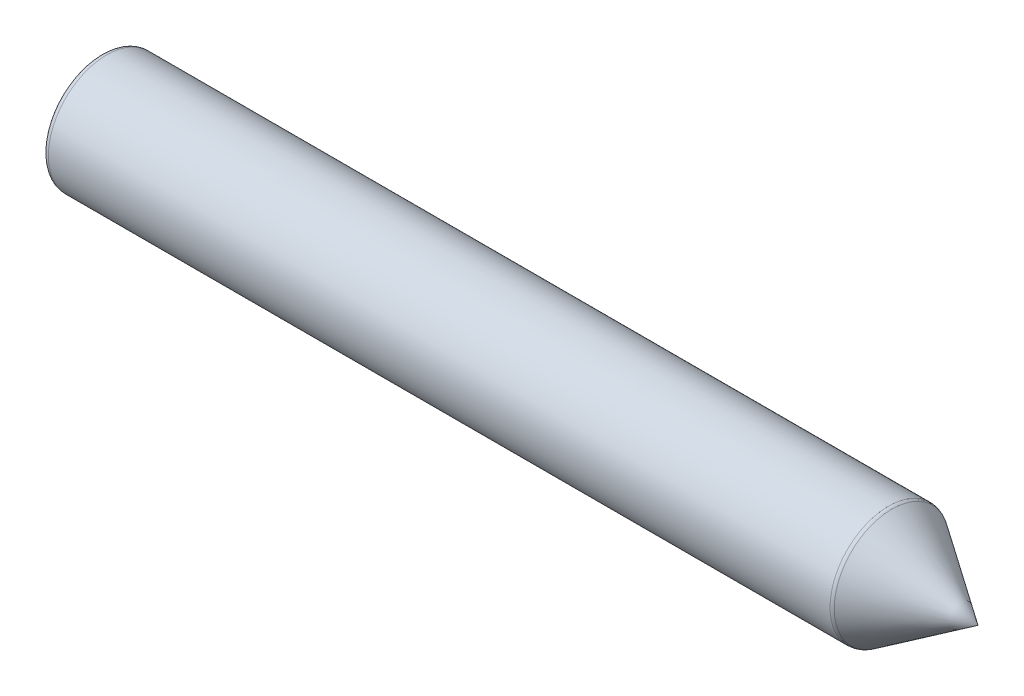
ISO-10303-21;
HEADER;
FILE_DESCRIPTION(('STEP AP214'),'2;1');
FILE_NAME('part.step','',(''),(''),'','','');
FILE_SCHEMA(('AUTOMOTIVE_DESIGN { 1 0 10303 214 1 1 1 1 }'));
ENDSEC;
DATA;
#1=APPLICATION_CONTEXT('core data for automotive mechanical design processes');
#2=APPLICATION_PROTOCOL_DEFINITION('international standard','automotive_design',2000,#1);
#3=PRODUCT_CONTEXT('',#1,'mechanical');
#4=PRODUCT('Part','Part','',(#3));
#5=PRODUCT_RELATED_PRODUCT_CATEGORY('part','',(#4));
#6=PRODUCT_DEFINITION_FORMATION('','',#4);
#7=PRODUCT_DEFINITION_CONTEXT('part definition',#1,'design');
#8=PRODUCT_DEFINITION('design','',#6,#7);
#9=PRODUCT_DEFINITION_SHAPE('','',#8);
#10=(LENGTH_UNIT() NAMED_UNIT(*) SI_UNIT(.MILLI.,.METRE.));
#11=(NAMED_UNIT(*) PLANE_ANGLE_UNIT() SI_UNIT($,.RADIAN.));
#12=(NAMED_UNIT(*) SI_UNIT($,.STERADIAN.) SOLID_ANGLE_UNIT());
#13=UNCERTAINTY_MEASURE_WITH_UNIT(LENGTH_MEASURE(1.E-05),#10,'distance_accuracy_value','');
#14=(GEOMETRIC_REPRESENTATION_CONTEXT(3) GLOBAL_UNCERTAINTY_ASSIGNED_CONTEXT((#13)) GLOBAL_UNIT_ASSIGNED_CONTEXT((#10,
#11,#12)) REPRESENTATION_CONTEXT('',''));
#15=CARTESIAN_POINT('',(0.,0.,0.));
#16=DIRECTION('',(0.,0.,1.));
#17=DIRECTION('',(1.,0.,0.));
#18=AXIS2_PLACEMENT_3D('',#15,#16,#17);
#19=CARTESIAN_POINT('',(150.,0.,0.));
#20=DIRECTION('',(-1.,0.,0.));
#21=DIRECTION('',(0.,0.,1.));
#22=AXIS2_PLACEMENT_3D('',#19,#20,#21);
#23=CONICAL_SURFACE('',#22,0.,0.588002603547568);
#24=CARTESIAN_POINT('',(135.251924558493,0.,0.));
#25=DIRECTION('',(1.,0.,0.));
#26=DIRECTION('',(0.,0.,-1.));
#27=AXIS2_PLACEMENT_3D('',#24,#25,#26);
#28=CIRCLE('',#27,9.83205029433784);
#29=CARTESIAN_POINT('',(135.251924558493,0.,-9.83205029433784));
#30=VERTEX_POINT('',#29);
#31=EDGE_CURVE('E42',#30,#30,#28,.T.);
#32=ORIENTED_EDGE('',*,*,#31,.T.);
#33=EDGE_LOOP('',(#32));
#34=FACE_BOUND('',#33,.T.);
#35=CARTESIAN_POINT('',(150.,0.,0.));
#36=VERTEX_POINT('',#35);
#37=VERTEX_LOOP('',#36);
#38=FACE_BOUND('',#37,.T.);
#39=ADVANCED_FACE('F35',(#34,#38),#23,.T.);
#40=CARTESIAN_POINT('',(0.,0.,0.));
#41=DIRECTION('',(-1.,0.,0.));
#42=DIRECTION('',(0.,0.,1.));
#43=AXIS2_PLACEMENT_3D('',#40,#41,#42);
#44=CYLINDRICAL_SURFACE('',#43,10.);
#45=CARTESIAN_POINT('',(134.697224362268,0.,0.));
#46=DIRECTION('',(1.,0.,0.));
#47=DIRECTION('',(0.,0.,-1.));
#48=AXIS2_PLACEMENT_3D('',#45,#46,#47);
#49=CIRCLE('',#48,10.);
#50=CARTESIAN_POINT('',(134.697224362268,0.,-10.));
#51=VERTEX_POINT('',#50);
#52=EDGE_CURVE('E70',#51,#51,#49,.F.);
#53=ORIENTED_EDGE('',*,*,#52,.T.);
#54=EDGE_LOOP('',(#53));
#55=FACE_BOUND('',#54,.T.);
#56=CARTESIAN_POINT('',(1.,0.,0.));
#57=DIRECTION('',(1.,0.,0.));
#58=DIRECTION('',(0.,0.,-1.));
#59=AXIS2_PLACEMENT_3D('',#56,#57,#58);
#60=CIRCLE('',#59,10.);
#61=CARTESIAN_POINT('',(1.,0.,-10.));
#62=VERTEX_POINT('',#61);
#63=EDGE_CURVE('E71',#62,#62,#60,.T.);
#64=ORIENTED_EDGE('',*,*,#63,.T.);
#65=EDGE_LOOP('',(#64));
#66=FACE_BOUND('',#65,.T.);
#67=ADVANCED_FACE('F46',(#55,#66),#44,.T.);
#68=CARTESIAN_POINT('',(0.,0.,0.));
#69=DIRECTION('',(1.,0.,0.));
#70=DIRECTION('',(0.,0.,-1.));
#71=AXIS2_PLACEMENT_3D('',#68,#69,#70);
#72=PLANE('',#71);
#73=CARTESIAN_POINT('',(0.,0.,0.));
#74=DIRECTION('',(1.,0.,0.));
#75=DIRECTION('',(0.,0.,-1.));
#76=AXIS2_PLACEMENT_3D('',#73,#74,#75);
#77=CIRCLE('',#76,9.);
#78=CARTESIAN_POINT('',(0.,0.,-9.));
#79=VERTEX_POINT('',#78);
#80=EDGE_CURVE('E11',#79,#79,#77,.F.);
#81=ORIENTED_EDGE('',*,*,#80,.T.);
#82=EDGE_LOOP('',(#81));
#83=FACE_BOUND('',#82,.T.);
#84=ADVANCED_FACE('F52',(#83),#72,.F.);
#85=CARTESIAN_POINT('',(134.697224362268,0.,0.));
#86=DIRECTION('',(1.,0.,0.));
#87=DIRECTION('',(0.,0.,-1.));
#88=AXIS2_PLACEMENT_3D('',#85,#86,#87);
#89=TOROIDAL_SURFACE('',#88,9.,1.);
#90=ORIENTED_EDGE('',*,*,#31,.F.);
#91=EDGE_LOOP('',(#90));
#92=FACE_BOUND('',#91,.T.);
#93=ORIENTED_EDGE('',*,*,#52,.F.);
#94=EDGE_LOOP('',(#93));
#95=FACE_BOUND('',#94,.T.);
#96=ADVANCED_FACE('F57',(#92,#95),#89,.T.);
#97=CARTESIAN_POINT('',(1.,0.,0.));
#98=DIRECTION('',(1.,0.,0.));
#99=DIRECTION('',(0.,0.,-1.));
#100=AXIS2_PLACEMENT_3D('',#97,#98,#99);
#101=TOROIDAL_SURFACE('',#100,9.,1.);
#102=ORIENTED_EDGE('',*,*,#63,.F.);
#103=EDGE_LOOP('',(#102));
#104=FACE_BOUND('',#103,.T.);
#105=ORIENTED_EDGE('',*,*,#80,.F.);
#106=EDGE_LOOP('',(#105));
#107=FACE_BOUND('',#106,.T.);
#108=ADVANCED_FACE('F37',(#104,#107),#101,.T.);
#109=CLOSED_SHELL('',(#39,#67,#84,#96,#108));
#110=MANIFOLD_SOLID_BREP('B2',#109);
#111=ADVANCED_BREP_SHAPE_REPRESENTATION('',(#18,#110),#14);
#112=SHAPE_DEFINITION_REPRESENTATION(#9,#111);
ENDSEC;
END-ISO-10303-21;
